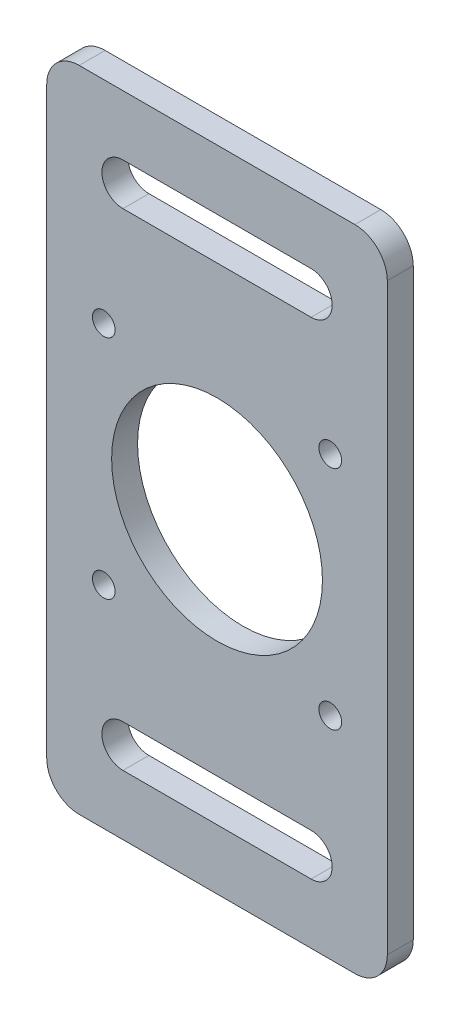
ISO-10303-21;
HEADER;
FILE_DESCRIPTION(('STEP AP214'),'2;1');
FILE_NAME('part.step','',(''),(''),'','','');
FILE_SCHEMA(('AUTOMOTIVE_DESIGN { 1 0 10303 214 1 1 1 1 }'));
ENDSEC;
DATA;
#1=APPLICATION_CONTEXT('core data for automotive mechanical design processes');
#2=APPLICATION_PROTOCOL_DEFINITION('international standard','automotive_design',2000,#1);
#3=PRODUCT_CONTEXT('',#1,'mechanical');
#4=PRODUCT('Part','Part','',(#3));
#5=PRODUCT_RELATED_PRODUCT_CATEGORY('part','',(#4));
#6=PRODUCT_DEFINITION_FORMATION('','',#4);
#7=PRODUCT_DEFINITION_CONTEXT('part definition',#1,'design');
#8=PRODUCT_DEFINITION('design','',#6,#7);
#9=PRODUCT_DEFINITION_SHAPE('','',#8);
#10=(LENGTH_UNIT() NAMED_UNIT(*) SI_UNIT(.MILLI.,.METRE.));
#11=(NAMED_UNIT(*) PLANE_ANGLE_UNIT() SI_UNIT($,.RADIAN.));
#12=(NAMED_UNIT(*) SI_UNIT($,.STERADIAN.) SOLID_ANGLE_UNIT());
#13=UNCERTAINTY_MEASURE_WITH_UNIT(LENGTH_MEASURE(1.E-05),#10,'distance_accuracy_value','');
#14=(GEOMETRIC_REPRESENTATION_CONTEXT(3) GLOBAL_UNCERTAINTY_ASSIGNED_CONTEXT((#13)) GLOBAL_UNIT_ASSIGNED_CONTEXT((#10,
#11,#12)) REPRESENTATION_CONTEXT('',''));
#15=CARTESIAN_POINT('',(0.,0.,0.));
#16=DIRECTION('',(0.,0.,1.));
#17=DIRECTION('',(1.,0.,0.));
#18=AXIS2_PLACEMENT_3D('',#15,#16,#17);
#19=CARTESIAN_POINT('',(0.,0.,8.));
#20=DIRECTION('',(0.,0.,1.));
#21=DIRECTION('',(1.,0.,0.));
#22=AXIS2_PLACEMENT_3D('',#19,#20,#21);
#23=PLANE('',#22);
#24=CARTESIAN_POINT('',(34.915,-34.915,8.));
#25=DIRECTION('',(0.,0.,1.));
#26=DIRECTION('',(1.,0.,0.));
#27=AXIS2_PLACEMENT_3D('',#24,#25,#26);
#28=CIRCLE('',#27,3.5);
#29=CARTESIAN_POINT('',(38.415,-34.915,8.));
#30=VERTEX_POINT('',#29);
#31=EDGE_CURVE('E234',#30,#30,#28,.T.);
#32=ORIENTED_EDGE('',*,*,#31,.F.);
#33=EDGE_LOOP('',(#32));
#34=FACE_BOUND('',#33,.T.);
#35=CARTESIAN_POINT('',(-34.915,34.915,8.));
#36=DIRECTION('',(0.,0.,1.));
#37=DIRECTION('',(1.,0.,0.));
#38=AXIS2_PLACEMENT_3D('',#35,#36,#37);
#39=CIRCLE('',#38,3.49999999999999);
#40=CARTESIAN_POINT('',(-31.4150000000001,34.915,8.));
#41=VERTEX_POINT('',#40);
#42=EDGE_CURVE('E246',#41,#41,#39,.T.);
#43=ORIENTED_EDGE('',*,*,#42,.F.);
#44=EDGE_LOOP('',(#43));
#45=FACE_BOUND('',#44,.T.);
#46=DIRECTION('',(-1.,0.,0.));
#47=VECTOR('',#46,1.);
#48=CARTESIAN_POINT('',(52.5,100.,8.));
#49=LINE('',#48,#47);
#50=CARTESIAN_POINT('',(42.5,100.,8.));
#51=VERTEX_POINT('',#50);
#52=CARTESIAN_POINT('',(-42.5,100.,8.));
#53=VERTEX_POINT('',#52);
#54=EDGE_CURVE('E266',#51,#53,#49,.T.);
#55=ORIENTED_EDGE('',*,*,#54,.T.);
#56=CARTESIAN_POINT('',(-42.5,90.,8.));
#57=DIRECTION('',(0.,0.,1.));
#58=DIRECTION('',(1.,0.,0.));
#59=AXIS2_PLACEMENT_3D('',#56,#57,#58);
#60=CIRCLE('',#59,10.);
#61=CARTESIAN_POINT('',(-52.5,90.,8.));
#62=VERTEX_POINT('',#61);
#63=EDGE_CURVE('E301',#53,#62,#60,.T.);
#64=ORIENTED_EDGE('',*,*,#63,.T.);
#65=DIRECTION('',(0.,-1.,0.));
#66=VECTOR('',#65,1.);
#67=CARTESIAN_POINT('',(-52.5,-100.,8.));
#68=LINE('',#67,#66);
#69=CARTESIAN_POINT('',(-52.5,-90.,8.));
#70=VERTEX_POINT('',#69);
#71=EDGE_CURVE('E258',#62,#70,#68,.T.);
#72=ORIENTED_EDGE('',*,*,#71,.T.);
#73=CARTESIAN_POINT('',(-42.5,-90.,8.));
#74=DIRECTION('',(0.,0.,1.));
#75=DIRECTION('',(1.,0.,0.));
#76=AXIS2_PLACEMENT_3D('',#73,#74,#75);
#77=CIRCLE('',#76,10.);
#78=CARTESIAN_POINT('',(-42.5,-100.,8.));
#79=VERTEX_POINT('',#78);
#80=EDGE_CURVE('E296',#70,#79,#77,.T.);
#81=ORIENTED_EDGE('',*,*,#80,.T.);
#82=DIRECTION('',(1.,0.,0.));
#83=VECTOR('',#82,1.);
#84=CARTESIAN_POINT('',(52.5,-100.,8.));
#85=LINE('',#84,#83);
#86=CARTESIAN_POINT('',(42.5,-100.,8.));
#87=VERTEX_POINT('',#86);
#88=EDGE_CURVE('E261',#79,#87,#85,.T.);
#89=ORIENTED_EDGE('',*,*,#88,.T.);
#90=CARTESIAN_POINT('',(42.5,-90.,8.));
#91=DIRECTION('',(0.,0.,1.));
#92=DIRECTION('',(1.,0.,0.));
#93=AXIS2_PLACEMENT_3D('',#90,#91,#92);
#94=CIRCLE('',#93,10.);
#95=CARTESIAN_POINT('',(52.5,-90.,8.));
#96=VERTEX_POINT('',#95);
#97=EDGE_CURVE('E63',#87,#96,#94,.T.);
#98=ORIENTED_EDGE('',*,*,#97,.T.);
#99=DIRECTION('',(0.,1.,0.));
#100=VECTOR('',#99,1.);
#101=CARTESIAN_POINT('',(52.5,-100.,8.));
#102=LINE('',#101,#100);
#103=CARTESIAN_POINT('',(52.5,90.,8.));
#104=VERTEX_POINT('',#103);
#105=EDGE_CURVE('E264',#96,#104,#102,.T.);
#106=ORIENTED_EDGE('',*,*,#105,.T.);
#107=CARTESIAN_POINT('',(42.5,90.,8.));
#108=DIRECTION('',(0.,0.,1.));
#109=DIRECTION('',(1.,0.,0.));
#110=AXIS2_PLACEMENT_3D('',#107,#108,#109);
#111=CIRCLE('',#110,10.);
#112=EDGE_CURVE('E299',#104,#51,#111,.T.);
#113=ORIENTED_EDGE('',*,*,#112,.T.);
#114=EDGE_LOOP('',(#55,#64,#72,#81,#89,#98,#106,#113));
#115=FACE_BOUND('',#114,.T.);
#116=CARTESIAN_POINT('',(0.,0.,8.));
#117=DIRECTION('',(0.,0.,1.));
#118=DIRECTION('',(1.,0.,0.));
#119=AXIS2_PLACEMENT_3D('',#116,#117,#118);
#120=CIRCLE('',#119,32.5);
#121=CARTESIAN_POINT('',(32.5,0.,8.));
#122=VERTEX_POINT('',#121);
#123=EDGE_CURVE('E252',#122,#122,#120,.T.);
#124=ORIENTED_EDGE('',*,*,#123,.F.);
#125=EDGE_LOOP('',(#124));
#126=FACE_BOUND('',#125,.T.);
#127=CARTESIAN_POINT('',(34.915,34.915,8.));
#128=DIRECTION('',(0.,0.,1.));
#129=DIRECTION('',(1.,0.,0.));
#130=AXIS2_PLACEMENT_3D('',#127,#128,#129);
#131=CIRCLE('',#130,3.5);
#132=CARTESIAN_POINT('',(38.415,34.915,8.));
#133=VERTEX_POINT('',#132);
#134=EDGE_CURVE('E240',#133,#133,#131,.T.);
#135=ORIENTED_EDGE('',*,*,#134,.F.);
#136=EDGE_LOOP('',(#135));
#137=FACE_BOUND('',#136,.T.);
#138=CARTESIAN_POINT('',(-34.915,-34.915,8.));
#139=DIRECTION('',(0.,0.,1.));
#140=DIRECTION('',(1.,0.,0.));
#141=AXIS2_PLACEMENT_3D('',#138,#139,#140);
#142=CIRCLE('',#141,3.5);
#143=CARTESIAN_POINT('',(-31.415,-34.915,8.));
#144=VERTEX_POINT('',#143);
#145=EDGE_CURVE('E228',#144,#144,#142,.T.);
#146=ORIENTED_EDGE('',*,*,#145,.F.);
#147=EDGE_LOOP('',(#146));
#148=FACE_BOUND('',#147,.T.);
#149=DIRECTION('',(1.,0.,0.));
#150=VECTOR('',#149,1.);
#151=CARTESIAN_POINT('',(-28.9999999999999,68.5,8.));
#152=LINE('',#151,#150);
#153=CARTESIAN_POINT('',(-28.9999999999999,68.5,8.));
#154=VERTEX_POINT('',#153);
#155=CARTESIAN_POINT('',(28.9999999999999,68.5,8.));
#156=VERTEX_POINT('',#155);
#157=EDGE_CURVE('E199',#154,#156,#152,.T.);
#158=ORIENTED_EDGE('',*,*,#157,.F.);
#159=CARTESIAN_POINT('',(-29.,75.,8.));
#160=DIRECTION('',(0.,0.,1.));
#161=DIRECTION('',(1.,0.,0.));
#162=AXIS2_PLACEMENT_3D('',#159,#160,#161);
#163=CIRCLE('',#162,6.50000000000002);
#164=CARTESIAN_POINT('',(-29.,81.5,8.));
#165=VERTEX_POINT('',#164);
#166=EDGE_CURVE('E197',#165,#154,#163,.T.);
#167=ORIENTED_EDGE('',*,*,#166,.F.);
#168=DIRECTION('',(-1.,0.,0.));
#169=VECTOR('',#168,1.);
#170=CARTESIAN_POINT('',(-29.,81.5,8.));
#171=LINE('',#170,#169);
#172=CARTESIAN_POINT('',(29.,81.5,8.));
#173=VERTEX_POINT('',#172);
#174=EDGE_CURVE('E205',#173,#165,#171,.T.);
#175=ORIENTED_EDGE('',*,*,#174,.F.);
#176=CARTESIAN_POINT('',(29.,75.,8.));
#177=DIRECTION('',(0.,0.,1.));
#178=DIRECTION('',(1.,0.,0.));
#179=AXIS2_PLACEMENT_3D('',#176,#177,#178);
#180=CIRCLE('',#179,6.50000000000002);
#181=EDGE_CURVE('E202',#156,#173,#180,.T.);
#182=ORIENTED_EDGE('',*,*,#181,.F.);
#183=EDGE_LOOP('',(#158,#167,#175,#182));
#184=FACE_BOUND('',#183,.T.);
#185=DIRECTION('',(1.,0.,0.));
#186=VECTOR('',#185,1.);
#187=CARTESIAN_POINT('',(-28.9999999999999,-81.5,8.));
#188=LINE('',#187,#186);
#189=CARTESIAN_POINT('',(-28.9999999999999,-81.5,8.));
#190=VERTEX_POINT('',#189);
#191=CARTESIAN_POINT('',(29.,-81.5,8.));
#192=VERTEX_POINT('',#191);
#193=EDGE_CURVE('E166',#190,#192,#188,.T.);
#194=ORIENTED_EDGE('',*,*,#193,.F.);
#195=CARTESIAN_POINT('',(-28.9999999999999,-75.,8.));
#196=DIRECTION('',(0.,0.,1.));
#197=DIRECTION('',(-1.,0.,0.));
#198=AXIS2_PLACEMENT_3D('',#195,#196,#197);
#199=CIRCLE('',#198,6.50000000000003);
#200=CARTESIAN_POINT('',(-28.9999999999999,-68.5,8.));
#201=VERTEX_POINT('',#200);
#202=EDGE_CURVE('E156',#201,#190,#199,.T.);
#203=ORIENTED_EDGE('',*,*,#202,.F.);
#204=DIRECTION('',(-1.,0.,0.));
#205=VECTOR('',#204,1.);
#206=CARTESIAN_POINT('',(-28.9999999999999,-68.5,8.));
#207=LINE('',#206,#205);
#208=CARTESIAN_POINT('',(29.,-68.4999999999999,8.));
#209=VERTEX_POINT('',#208);
#210=EDGE_CURVE('E181',#209,#201,#207,.T.);
#211=ORIENTED_EDGE('',*,*,#210,.F.);
#212=CARTESIAN_POINT('',(29.,-75.,8.));
#213=DIRECTION('',(0.,0.,1.));
#214=DIRECTION('',(-1.,0.,0.));
#215=AXIS2_PLACEMENT_3D('',#212,#213,#214);
#216=CIRCLE('',#215,6.50000000000003);
#217=EDGE_CURVE('E179',#192,#209,#216,.T.);
#218=ORIENTED_EDGE('',*,*,#217,.F.);
#219=EDGE_LOOP('',(#194,#203,#211,#218));
#220=FACE_BOUND('',#219,.T.);
#221=ADVANCED_FACE('F41',(#34,#45,#115,#126,#137,#148,#184,#220),#23,.T.);
#222=CARTESIAN_POINT('',(0.,0.,0.));
#223=DIRECTION('',(0.,0.,1.));
#224=DIRECTION('',(1.,0.,0.));
#225=AXIS2_PLACEMENT_3D('',#222,#223,#224);
#226=PLANE('',#225);
#227=CARTESIAN_POINT('',(-29.,75.,0.));
#228=DIRECTION('',(0.,0.,1.));
#229=DIRECTION('',(1.,0.,0.));
#230=AXIS2_PLACEMENT_3D('',#227,#228,#229);
#231=CIRCLE('',#230,6.50000000000002);
#232=CARTESIAN_POINT('',(-29.,81.5,0.));
#233=VERTEX_POINT('',#232);
#234=CARTESIAN_POINT('',(-28.9999999999999,68.5,0.));
#235=VERTEX_POINT('',#234);
#236=EDGE_CURVE('E174',#233,#235,#231,.T.);
#237=ORIENTED_EDGE('',*,*,#236,.T.);
#238=DIRECTION('',(1.,0.,0.));
#239=VECTOR('',#238,1.);
#240=CARTESIAN_POINT('',(-28.9999999999999,68.5,0.));
#241=LINE('',#240,#239);
#242=CARTESIAN_POINT('',(28.9999999999999,68.5,0.));
#243=VERTEX_POINT('',#242);
#244=EDGE_CURVE('E210',#235,#243,#241,.T.);
#245=ORIENTED_EDGE('',*,*,#244,.T.);
#246=CARTESIAN_POINT('',(29.,75.,0.));
#247=DIRECTION('',(0.,0.,1.));
#248=DIRECTION('',(1.,0.,0.));
#249=AXIS2_PLACEMENT_3D('',#246,#247,#248);
#250=CIRCLE('',#249,6.50000000000002);
#251=CARTESIAN_POINT('',(29.,81.5,0.));
#252=VERTEX_POINT('',#251);
#253=EDGE_CURVE('E213',#243,#252,#250,.T.);
#254=ORIENTED_EDGE('',*,*,#253,.T.);
#255=DIRECTION('',(-1.,0.,0.));
#256=VECTOR('',#255,1.);
#257=CARTESIAN_POINT('',(-29.,81.5,0.));
#258=LINE('',#257,#256);
#259=EDGE_CURVE('E200',#252,#233,#258,.T.);
#260=ORIENTED_EDGE('',*,*,#259,.T.);
#261=EDGE_LOOP('',(#237,#245,#254,#260));
#262=FACE_BOUND('',#261,.T.);
#263=DIRECTION('',(0.,-1.,0.));
#264=VECTOR('',#263,1.);
#265=CARTESIAN_POINT('',(-52.5,-100.,0.));
#266=LINE('',#265,#264);
#267=CARTESIAN_POINT('',(-52.5,90.,0.));
#268=VERTEX_POINT('',#267);
#269=CARTESIAN_POINT('',(-52.5,-90.,0.));
#270=VERTEX_POINT('',#269);
#271=EDGE_CURVE('E255',#268,#270,#266,.T.);
#272=ORIENTED_EDGE('',*,*,#271,.F.);
#273=CARTESIAN_POINT('',(-42.5,90.,0.));
#274=DIRECTION('',(0.,0.,1.));
#275=DIRECTION('',(1.,0.,0.));
#276=AXIS2_PLACEMENT_3D('',#273,#274,#275);
#277=CIRCLE('',#276,10.);
#278=CARTESIAN_POINT('',(-42.5,100.,0.));
#279=VERTEX_POINT('',#278);
#280=EDGE_CURVE('E289',#268,#279,#277,.F.);
#281=ORIENTED_EDGE('',*,*,#280,.T.);
#282=DIRECTION('',(-1.,0.,0.));
#283=VECTOR('',#282,1.);
#284=CARTESIAN_POINT('',(52.5,100.,0.));
#285=LINE('',#284,#283);
#286=CARTESIAN_POINT('',(42.5,100.,0.));
#287=VERTEX_POINT('',#286);
#288=EDGE_CURVE('E262',#287,#279,#285,.T.);
#289=ORIENTED_EDGE('',*,*,#288,.F.);
#290=CARTESIAN_POINT('',(42.5,90.,0.));
#291=DIRECTION('',(0.,0.,1.));
#292=DIRECTION('',(1.,0.,0.));
#293=AXIS2_PLACEMENT_3D('',#290,#291,#292);
#294=CIRCLE('',#293,10.);
#295=CARTESIAN_POINT('',(52.5,90.,0.));
#296=VERTEX_POINT('',#295);
#297=EDGE_CURVE('E287',#287,#296,#294,.F.);
#298=ORIENTED_EDGE('',*,*,#297,.T.);
#299=DIRECTION('',(0.,1.,0.));
#300=VECTOR('',#299,1.);
#301=CARTESIAN_POINT('',(52.5,-100.,0.));
#302=LINE('',#301,#300);
#303=CARTESIAN_POINT('',(52.5,-90.,0.));
#304=VERTEX_POINT('',#303);
#305=EDGE_CURVE('E275',#304,#296,#302,.T.);
#306=ORIENTED_EDGE('',*,*,#305,.F.);
#307=CARTESIAN_POINT('',(42.5,-90.,0.));
#308=DIRECTION('',(0.,0.,1.));
#309=DIRECTION('',(1.,0.,0.));
#310=AXIS2_PLACEMENT_3D('',#307,#308,#309);
#311=CIRCLE('',#310,10.);
#312=CARTESIAN_POINT('',(42.5,-100.,0.));
#313=VERTEX_POINT('',#312);
#314=EDGE_CURVE('E285',#304,#313,#311,.F.);
#315=ORIENTED_EDGE('',*,*,#314,.T.);
#316=DIRECTION('',(1.,0.,0.));
#317=VECTOR('',#316,1.);
#318=CARTESIAN_POINT('',(52.5,-100.,0.));
#319=LINE('',#318,#317);
#320=CARTESIAN_POINT('',(-42.5,-100.,0.));
#321=VERTEX_POINT('',#320);
#322=EDGE_CURVE('E272',#321,#313,#319,.T.);
#323=ORIENTED_EDGE('',*,*,#322,.F.);
#324=CARTESIAN_POINT('',(-42.5,-90.,0.));
#325=DIRECTION('',(0.,0.,1.));
#326=DIRECTION('',(1.,0.,0.));
#327=AXIS2_PLACEMENT_3D('',#324,#325,#326);
#328=CIRCLE('',#327,10.);
#329=EDGE_CURVE('E283',#321,#270,#328,.F.);
#330=ORIENTED_EDGE('',*,*,#329,.T.);
#331=EDGE_LOOP('',(#272,#281,#289,#298,#306,#315,#323,#330));
#332=FACE_BOUND('',#331,.T.);
#333=CARTESIAN_POINT('',(0.,0.,0.));
#334=DIRECTION('',(0.,0.,1.));
#335=DIRECTION('',(1.,0.,0.));
#336=AXIS2_PLACEMENT_3D('',#333,#334,#335);
#337=CIRCLE('',#336,32.5);
#338=CARTESIAN_POINT('',(32.5,0.,0.));
#339=VERTEX_POINT('',#338);
#340=EDGE_CURVE('E249',#339,#339,#337,.T.);
#341=ORIENTED_EDGE('',*,*,#340,.T.);
#342=EDGE_LOOP('',(#341));
#343=FACE_BOUND('',#342,.T.);
#344=CARTESIAN_POINT('',(-34.915,34.915,0.));
#345=DIRECTION('',(0.,0.,1.));
#346=DIRECTION('',(1.,0.,0.));
#347=AXIS2_PLACEMENT_3D('',#344,#345,#346);
#348=CIRCLE('',#347,3.49999999999999);
#349=CARTESIAN_POINT('',(-31.4150000000001,34.915,0.));
#350=VERTEX_POINT('',#349);
#351=EDGE_CURVE('E243',#350,#350,#348,.T.);
#352=ORIENTED_EDGE('',*,*,#351,.T.);
#353=EDGE_LOOP('',(#352));
#354=FACE_BOUND('',#353,.T.);
#355=CARTESIAN_POINT('',(34.915,34.915,0.));
#356=DIRECTION('',(0.,0.,1.));
#357=DIRECTION('',(1.,0.,0.));
#358=AXIS2_PLACEMENT_3D('',#355,#356,#357);
#359=CIRCLE('',#358,3.5);
#360=CARTESIAN_POINT('',(38.415,34.915,0.));
#361=VERTEX_POINT('',#360);
#362=EDGE_CURVE('E237',#361,#361,#359,.T.);
#363=ORIENTED_EDGE('',*,*,#362,.T.);
#364=EDGE_LOOP('',(#363));
#365=FACE_BOUND('',#364,.T.);
#366=CARTESIAN_POINT('',(34.915,-34.915,0.));
#367=DIRECTION('',(0.,0.,1.));
#368=DIRECTION('',(1.,0.,0.));
#369=AXIS2_PLACEMENT_3D('',#366,#367,#368);
#370=CIRCLE('',#369,3.5);
#371=CARTESIAN_POINT('',(38.415,-34.915,0.));
#372=VERTEX_POINT('',#371);
#373=EDGE_CURVE('E231',#372,#372,#370,.T.);
#374=ORIENTED_EDGE('',*,*,#373,.T.);
#375=EDGE_LOOP('',(#374));
#376=FACE_BOUND('',#375,.T.);
#377=CARTESIAN_POINT('',(-34.915,-34.915,0.));
#378=DIRECTION('',(0.,0.,1.));
#379=DIRECTION('',(1.,0.,0.));
#380=AXIS2_PLACEMENT_3D('',#377,#378,#379);
#381=CIRCLE('',#380,3.5);
#382=CARTESIAN_POINT('',(-31.415,-34.915,0.));
#383=VERTEX_POINT('',#382);
#384=EDGE_CURVE('E227',#383,#383,#381,.T.);
#385=ORIENTED_EDGE('',*,*,#384,.T.);
#386=EDGE_LOOP('',(#385));
#387=FACE_BOUND('',#386,.T.);
#388=CARTESIAN_POINT('',(-28.9999999999999,-75.,0.));
#389=DIRECTION('',(0.,0.,1.));
#390=DIRECTION('',(-1.,0.,0.));
#391=AXIS2_PLACEMENT_3D('',#388,#389,#390);
#392=CIRCLE('',#391,6.50000000000003);
#393=CARTESIAN_POINT('',(-28.9999999999999,-68.5,0.));
#394=VERTEX_POINT('',#393);
#395=CARTESIAN_POINT('',(-28.9999999999999,-81.5,0.));
#396=VERTEX_POINT('',#395);
#397=EDGE_CURVE('E185',#394,#396,#392,.T.);
#398=ORIENTED_EDGE('',*,*,#397,.T.);
#399=DIRECTION('',(1.,0.,0.));
#400=VECTOR('',#399,1.);
#401=CARTESIAN_POINT('',(-28.9999999999999,-81.5,0.));
#402=LINE('',#401,#400);
#403=CARTESIAN_POINT('',(29.,-81.5,0.));
#404=VERTEX_POINT('',#403);
#405=EDGE_CURVE('E173',#396,#404,#402,.T.);
#406=ORIENTED_EDGE('',*,*,#405,.T.);
#407=CARTESIAN_POINT('',(29.,-75.,0.));
#408=DIRECTION('',(0.,0.,1.));
#409=DIRECTION('',(-1.,0.,0.));
#410=AXIS2_PLACEMENT_3D('',#407,#408,#409);
#411=CIRCLE('',#410,6.50000000000003);
#412=CARTESIAN_POINT('',(29.,-68.5,0.));
#413=VERTEX_POINT('',#412);
#414=EDGE_CURVE('E188',#404,#413,#411,.T.);
#415=ORIENTED_EDGE('',*,*,#414,.T.);
#416=DIRECTION('',(-1.,0.,0.));
#417=VECTOR('',#416,1.);
#418=CARTESIAN_POINT('',(-28.9999999999999,-68.5,0.));
#419=LINE('',#418,#417);
#420=EDGE_CURVE('E167',#413,#394,#419,.T.);
#421=ORIENTED_EDGE('',*,*,#420,.T.);
#422=EDGE_LOOP('',(#398,#406,#415,#421));
#423=FACE_BOUND('',#422,.T.);
#424=ADVANCED_FACE('F317',(#262,#332,#343,#354,#365,#376,#387,#423),#226,.F.);
#425=CARTESIAN_POINT('',(-52.5,-100.,8.));
#426=DIRECTION('',(1.,0.,0.));
#427=DIRECTION('',(0.,0.,-1.));
#428=AXIS2_PLACEMENT_3D('',#425,#426,#427);
#429=PLANE('',#428);
#430=ORIENTED_EDGE('',*,*,#71,.F.);
#431=DIRECTION('',(0.,0.,-1.));
#432=VECTOR('',#431,1.);
#433=CARTESIAN_POINT('',(-52.5,90.,8.));
#434=LINE('',#433,#432);
#435=EDGE_CURVE('E280',#62,#268,#434,.T.);
#436=ORIENTED_EDGE('',*,*,#435,.T.);
#437=ORIENTED_EDGE('',*,*,#271,.T.);
#438=DIRECTION('',(0.,0.,-1.));
#439=VECTOR('',#438,1.);
#440=CARTESIAN_POINT('',(-52.5,-90.,8.));
#441=LINE('',#440,#439);
#442=EDGE_CURVE('E269',#270,#70,#441,.F.);
#443=ORIENTED_EDGE('',*,*,#442,.T.);
#444=EDGE_LOOP('',(#430,#436,#437,#443));
#445=FACE_BOUND('',#444,.T.);
#446=ADVANCED_FACE('F340',(#445),#429,.F.);
#447=CARTESIAN_POINT('',(52.5,-100.,8.));
#448=DIRECTION('',(0.,1.,0.));
#449=DIRECTION('',(0.,0.,1.));
#450=AXIS2_PLACEMENT_3D('',#447,#448,#449);
#451=PLANE('',#450);
#452=ORIENTED_EDGE('',*,*,#322,.T.);
#453=DIRECTION('',(0.,0.,-1.));
#454=VECTOR('',#453,1.);
#455=CARTESIAN_POINT('',(42.5,-100.,8.));
#456=LINE('',#455,#454);
#457=EDGE_CURVE('E11',#313,#87,#456,.F.);
#458=ORIENTED_EDGE('',*,*,#457,.T.);
#459=ORIENTED_EDGE('',*,*,#88,.F.);
#460=DIRECTION('',(0.,0.,-1.));
#461=VECTOR('',#460,1.);
#462=CARTESIAN_POINT('',(-42.5,-100.,8.));
#463=LINE('',#462,#461);
#464=EDGE_CURVE('E49',#79,#321,#463,.T.);
#465=ORIENTED_EDGE('',*,*,#464,.T.);
#466=EDGE_LOOP('',(#452,#458,#459,#465));
#467=FACE_BOUND('',#466,.T.);
#468=ADVANCED_FACE('F311',(#467),#451,.F.);
#469=CARTESIAN_POINT('',(52.5,-100.,8.));
#470=DIRECTION('',(-1.,0.,0.));
#471=DIRECTION('',(0.,0.,1.));
#472=AXIS2_PLACEMENT_3D('',#469,#470,#471);
#473=PLANE('',#472);
#474=ORIENTED_EDGE('',*,*,#305,.T.);
#475=DIRECTION('',(0.,0.,-1.));
#476=VECTOR('',#475,1.);
#477=CARTESIAN_POINT('',(52.5,90.,8.));
#478=LINE('',#477,#476);
#479=EDGE_CURVE('E56',#296,#104,#478,.F.);
#480=ORIENTED_EDGE('',*,*,#479,.T.);
#481=ORIENTED_EDGE('',*,*,#105,.F.);
#482=DIRECTION('',(0.,0.,-1.));
#483=VECTOR('',#482,1.);
#484=CARTESIAN_POINT('',(52.5,-90.,8.));
#485=LINE('',#484,#483);
#486=EDGE_CURVE('E303',#96,#304,#485,.T.);
#487=ORIENTED_EDGE('',*,*,#486,.T.);
#488=EDGE_LOOP('',(#474,#480,#481,#487));
#489=FACE_BOUND('',#488,.T.);
#490=ADVANCED_FACE('F323',(#489),#473,.F.);
#491=CARTESIAN_POINT('',(52.5,100.,8.));
#492=DIRECTION('',(0.,-1.,0.));
#493=DIRECTION('',(1.,0.,0.));
#494=AXIS2_PLACEMENT_3D('',#491,#492,#493);
#495=PLANE('',#494);
#496=ORIENTED_EDGE('',*,*,#288,.T.);
#497=DIRECTION('',(0.,0.,-1.));
#498=VECTOR('',#497,1.);
#499=CARTESIAN_POINT('',(-42.5,100.,8.));
#500=LINE('',#499,#498);
#501=EDGE_CURVE('E294',#279,#53,#500,.F.);
#502=ORIENTED_EDGE('',*,*,#501,.T.);
#503=ORIENTED_EDGE('',*,*,#54,.F.);
#504=DIRECTION('',(0.,0.,-1.));
#505=VECTOR('',#504,1.);
#506=CARTESIAN_POINT('',(42.5,100.,8.));
#507=LINE('',#506,#505);
#508=EDGE_CURVE('E291',#51,#287,#507,.T.);
#509=ORIENTED_EDGE('',*,*,#508,.T.);
#510=EDGE_LOOP('',(#496,#502,#503,#509));
#511=FACE_BOUND('',#510,.T.);
#512=ADVANCED_FACE('F332',(#511),#495,.F.);
#513=CARTESIAN_POINT('',(0.,0.,8.));
#514=DIRECTION('',(0.,0.,-1.));
#515=DIRECTION('',(-1.,0.,0.));
#516=AXIS2_PLACEMENT_3D('',#513,#514,#515);
#517=CYLINDRICAL_SURFACE('',#516,32.5);
#518=ORIENTED_EDGE('',*,*,#123,.T.);
#519=EDGE_LOOP('',(#518));
#520=FACE_BOUND('',#519,.T.);
#521=ORIENTED_EDGE('',*,*,#340,.F.);
#522=EDGE_LOOP('',(#521));
#523=FACE_BOUND('',#522,.T.);
#524=ADVANCED_FACE('F359',(#520,#523),#517,.F.);
#525=CARTESIAN_POINT('',(-34.915,34.915,8.));
#526=DIRECTION('',(0.,0.,-1.));
#527=DIRECTION('',(-1.,0.,0.));
#528=AXIS2_PLACEMENT_3D('',#525,#526,#527);
#529=CYLINDRICAL_SURFACE('',#528,3.49999999999999);
#530=ORIENTED_EDGE('',*,*,#42,.T.);
#531=EDGE_LOOP('',(#530));
#532=FACE_BOUND('',#531,.T.);
#533=ORIENTED_EDGE('',*,*,#351,.F.);
#534=EDGE_LOOP('',(#533));
#535=FACE_BOUND('',#534,.T.);
#536=ADVANCED_FACE('F536',(#532,#535),#529,.F.);
#537=CARTESIAN_POINT('',(34.915,34.915,8.));
#538=DIRECTION('',(0.,0.,-1.));
#539=DIRECTION('',(-1.,0.,0.));
#540=AXIS2_PLACEMENT_3D('',#537,#538,#539);
#541=CYLINDRICAL_SURFACE('',#540,3.5);
#542=ORIENTED_EDGE('',*,*,#134,.T.);
#543=EDGE_LOOP('',(#542));
#544=FACE_BOUND('',#543,.T.);
#545=ORIENTED_EDGE('',*,*,#362,.F.);
#546=EDGE_LOOP('',(#545));
#547=FACE_BOUND('',#546,.T.);
#548=ADVANCED_FACE('F526',(#544,#547),#541,.F.);
#549=CARTESIAN_POINT('',(34.915,-34.915,8.));
#550=DIRECTION('',(0.,0.,-1.));
#551=DIRECTION('',(-1.,0.,0.));
#552=AXIS2_PLACEMENT_3D('',#549,#550,#551);
#553=CYLINDRICAL_SURFACE('',#552,3.5);
#554=ORIENTED_EDGE('',*,*,#31,.T.);
#555=EDGE_LOOP('',(#554));
#556=FACE_BOUND('',#555,.T.);
#557=ORIENTED_EDGE('',*,*,#373,.F.);
#558=EDGE_LOOP('',(#557));
#559=FACE_BOUND('',#558,.T.);
#560=ADVANCED_FACE('F516',(#556,#559),#553,.F.);
#561=CARTESIAN_POINT('',(-34.915,-34.915,8.));
#562=DIRECTION('',(0.,0.,-1.));
#563=DIRECTION('',(-1.,0.,0.));
#564=AXIS2_PLACEMENT_3D('',#561,#562,#563);
#565=CYLINDRICAL_SURFACE('',#564,3.5);
#566=ORIENTED_EDGE('',*,*,#145,.T.);
#567=EDGE_LOOP('',(#566));
#568=FACE_BOUND('',#567,.T.);
#569=ORIENTED_EDGE('',*,*,#384,.F.);
#570=EDGE_LOOP('',(#569));
#571=FACE_BOUND('',#570,.T.);
#572=ADVANCED_FACE('F506',(#568,#571),#565,.F.);
#573=CARTESIAN_POINT('',(-29.,75.,8.));
#574=DIRECTION('',(0.,0.,-1.));
#575=DIRECTION('',(-1.,0.,0.));
#576=AXIS2_PLACEMENT_3D('',#573,#574,#575);
#577=CYLINDRICAL_SURFACE('',#576,6.50000000000002);
#578=ORIENTED_EDGE('',*,*,#236,.F.);
#579=DIRECTION('',(0.,0.,-1.));
#580=VECTOR('',#579,1.);
#581=CARTESIAN_POINT('',(-29.,81.5,8.));
#582=LINE('',#581,#580);
#583=EDGE_CURVE('E207',#165,#233,#582,.T.);
#584=ORIENTED_EDGE('',*,*,#583,.F.);
#585=ORIENTED_EDGE('',*,*,#166,.T.);
#586=DIRECTION('',(0.,0.,-1.));
#587=VECTOR('',#586,1.);
#588=CARTESIAN_POINT('',(-28.9999999999999,68.5,8.));
#589=LINE('',#588,#587);
#590=EDGE_CURVE('E224',#154,#235,#589,.T.);
#591=ORIENTED_EDGE('',*,*,#590,.T.);
#592=EDGE_LOOP('',(#578,#584,#585,#591));
#593=FACE_BOUND('',#592,.T.);
#594=ADVANCED_FACE('F496',(#593),#577,.F.);
#595=CARTESIAN_POINT('',(-28.9999999999999,68.5,8.));
#596=DIRECTION('',(0.,1.,0.));
#597=DIRECTION('',(-1.,0.,0.));
#598=AXIS2_PLACEMENT_3D('',#595,#596,#597);
#599=PLANE('',#598);
#600=ORIENTED_EDGE('',*,*,#244,.F.);
#601=ORIENTED_EDGE('',*,*,#590,.F.);
#602=ORIENTED_EDGE('',*,*,#157,.T.);
#603=DIRECTION('',(0.,0.,-1.));
#604=VECTOR('',#603,1.);
#605=CARTESIAN_POINT('',(28.9999999999999,68.5,8.));
#606=LINE('',#605,#604);
#607=EDGE_CURVE('E222',#156,#243,#606,.T.);
#608=ORIENTED_EDGE('',*,*,#607,.T.);
#609=EDGE_LOOP('',(#600,#601,#602,#608));
#610=FACE_BOUND('',#609,.T.);
#611=ADVANCED_FACE('F486',(#610),#599,.T.);
#612=CARTESIAN_POINT('',(29.,75.,8.));
#613=DIRECTION('',(0.,0.,-1.));
#614=DIRECTION('',(-1.,0.,0.));
#615=AXIS2_PLACEMENT_3D('',#612,#613,#614);
#616=CYLINDRICAL_SURFACE('',#615,6.50000000000002);
#617=ORIENTED_EDGE('',*,*,#253,.F.);
#618=ORIENTED_EDGE('',*,*,#607,.F.);
#619=ORIENTED_EDGE('',*,*,#181,.T.);
#620=DIRECTION('',(0.,0.,-1.));
#621=VECTOR('',#620,1.);
#622=CARTESIAN_POINT('',(29.,81.5,8.));
#623=LINE('',#622,#621);
#624=EDGE_CURVE('E220',#173,#252,#623,.T.);
#625=ORIENTED_EDGE('',*,*,#624,.T.);
#626=EDGE_LOOP('',(#617,#618,#619,#625));
#627=FACE_BOUND('',#626,.T.);
#628=ADVANCED_FACE('F476',(#627),#616,.F.);
#629=CARTESIAN_POINT('',(-29.,81.5,8.));
#630=DIRECTION('',(0.,-1.,0.));
#631=DIRECTION('',(1.,0.,0.));
#632=AXIS2_PLACEMENT_3D('',#629,#630,#631);
#633=PLANE('',#632);
#634=ORIENTED_EDGE('',*,*,#259,.F.);
#635=ORIENTED_EDGE('',*,*,#624,.F.);
#636=ORIENTED_EDGE('',*,*,#174,.T.);
#637=ORIENTED_EDGE('',*,*,#583,.T.);
#638=EDGE_LOOP('',(#634,#635,#636,#637));
#639=FACE_BOUND('',#638,.T.);
#640=ADVANCED_FACE('F467',(#639),#633,.T.);
#641=CARTESIAN_POINT('',(-28.9999999999999,-75.,8.));
#642=DIRECTION('',(0.,0.,-1.));
#643=DIRECTION('',(-1.,0.,0.));
#644=AXIS2_PLACEMENT_3D('',#641,#642,#643);
#645=CYLINDRICAL_SURFACE('',#644,6.50000000000003);
#646=ORIENTED_EDGE('',*,*,#397,.F.);
#647=DIRECTION('',(0.,0.,-1.));
#648=VECTOR('',#647,1.);
#649=CARTESIAN_POINT('',(-28.9999999999999,-68.5,8.));
#650=LINE('',#649,#648);
#651=EDGE_CURVE('E162',#201,#394,#650,.T.);
#652=ORIENTED_EDGE('',*,*,#651,.F.);
#653=ORIENTED_EDGE('',*,*,#202,.T.);
#654=DIRECTION('',(0.,0.,-1.));
#655=VECTOR('',#654,1.);
#656=CARTESIAN_POINT('',(-28.9999999999999,-81.5,8.));
#657=LINE('',#656,#655);
#658=EDGE_CURVE('E159',#190,#396,#657,.T.);
#659=ORIENTED_EDGE('',*,*,#658,.T.);
#660=EDGE_LOOP('',(#646,#652,#653,#659));
#661=FACE_BOUND('',#660,.T.);
#662=ADVANCED_FACE('F158',(#661),#645,.F.);
#663=CARTESIAN_POINT('',(-28.9999999999999,-81.5,8.));
#664=DIRECTION('',(0.,1.,0.));
#665=DIRECTION('',(-1.,0.,0.));
#666=AXIS2_PLACEMENT_3D('',#663,#664,#665);
#667=PLANE('',#666);
#668=ORIENTED_EDGE('',*,*,#405,.F.);
#669=ORIENTED_EDGE('',*,*,#658,.F.);
#670=ORIENTED_EDGE('',*,*,#193,.T.);
#671=DIRECTION('',(0.,0.,-1.));
#672=VECTOR('',#671,1.);
#673=CARTESIAN_POINT('',(29.,-81.5,8.));
#674=LINE('',#673,#672);
#675=EDGE_CURVE('E175',#192,#404,#674,.T.);
#676=ORIENTED_EDGE('',*,*,#675,.T.);
#677=EDGE_LOOP('',(#668,#669,#670,#676));
#678=FACE_BOUND('',#677,.T.);
#679=ADVANCED_FACE('F170',(#678),#667,.T.);
#680=CARTESIAN_POINT('',(29.,-75.,8.));
#681=DIRECTION('',(0.,0.,-1.));
#682=DIRECTION('',(-1.,0.,0.));
#683=AXIS2_PLACEMENT_3D('',#680,#681,#682);
#684=CYLINDRICAL_SURFACE('',#683,6.50000000000003);
#685=ORIENTED_EDGE('',*,*,#414,.F.);
#686=ORIENTED_EDGE('',*,*,#675,.F.);
#687=ORIENTED_EDGE('',*,*,#217,.T.);
#688=DIRECTION('',(0.,0.,-1.));
#689=VECTOR('',#688,1.);
#690=CARTESIAN_POINT('',(29.,-68.5,8.));
#691=LINE('',#690,#689);
#692=EDGE_CURVE('E194',#209,#413,#691,.T.);
#693=ORIENTED_EDGE('',*,*,#692,.T.);
#694=EDGE_LOOP('',(#685,#686,#687,#693));
#695=FACE_BOUND('',#694,.T.);
#696=ADVANCED_FACE('F440',(#695),#684,.F.);
#697=CARTESIAN_POINT('',(-28.9999999999999,-68.5,8.));
#698=DIRECTION('',(0.,-1.,0.));
#699=DIRECTION('',(1.,0.,0.));
#700=AXIS2_PLACEMENT_3D('',#697,#698,#699);
#701=PLANE('',#700);
#702=ORIENTED_EDGE('',*,*,#420,.F.);
#703=ORIENTED_EDGE('',*,*,#692,.F.);
#704=ORIENTED_EDGE('',*,*,#210,.T.);
#705=ORIENTED_EDGE('',*,*,#651,.T.);
#706=EDGE_LOOP('',(#702,#703,#704,#705));
#707=FACE_BOUND('',#706,.T.);
#708=ADVANCED_FACE('F372',(#707),#701,.T.);
#709=CARTESIAN_POINT('',(-42.5,90.,8.));
#710=DIRECTION('',(0.,0.,-1.));
#711=DIRECTION('',(-1.,0.,0.));
#712=AXIS2_PLACEMENT_3D('',#709,#710,#711);
#713=CYLINDRICAL_SURFACE('',#712,10.);
#714=ORIENTED_EDGE('',*,*,#63,.F.);
#715=ORIENTED_EDGE('',*,*,#501,.F.);
#716=ORIENTED_EDGE('',*,*,#280,.F.);
#717=ORIENTED_EDGE('',*,*,#435,.F.);
#718=EDGE_LOOP('',(#714,#715,#716,#717));
#719=FACE_BOUND('',#718,.T.);
#720=ADVANCED_FACE('F337',(#719),#713,.T.);
#721=CARTESIAN_POINT('',(42.5,90.,8.));
#722=DIRECTION('',(0.,0.,-1.));
#723=DIRECTION('',(-1.,0.,0.));
#724=AXIS2_PLACEMENT_3D('',#721,#722,#723);
#725=CYLINDRICAL_SURFACE('',#724,10.);
#726=ORIENTED_EDGE('',*,*,#112,.F.);
#727=ORIENTED_EDGE('',*,*,#479,.F.);
#728=ORIENTED_EDGE('',*,*,#297,.F.);
#729=ORIENTED_EDGE('',*,*,#508,.F.);
#730=EDGE_LOOP('',(#726,#727,#728,#729));
#731=FACE_BOUND('',#730,.T.);
#732=ADVANCED_FACE('F329',(#731),#725,.T.);
#733=CARTESIAN_POINT('',(42.5,-90.,8.));
#734=DIRECTION('',(0.,0.,-1.));
#735=DIRECTION('',(-1.,0.,0.));
#736=AXIS2_PLACEMENT_3D('',#733,#734,#735);
#737=CYLINDRICAL_SURFACE('',#736,10.);
#738=ORIENTED_EDGE('',*,*,#97,.F.);
#739=ORIENTED_EDGE('',*,*,#457,.F.);
#740=ORIENTED_EDGE('',*,*,#314,.F.);
#741=ORIENTED_EDGE('',*,*,#486,.F.);
#742=EDGE_LOOP('',(#738,#739,#740,#741));
#743=FACE_BOUND('',#742,.T.);
#744=ADVANCED_FACE('F322',(#743),#737,.T.);
#745=CARTESIAN_POINT('',(-42.5,-90.,8.));
#746=DIRECTION('',(0.,0.,-1.));
#747=DIRECTION('',(-1.,0.,0.));
#748=AXIS2_PLACEMENT_3D('',#745,#746,#747);
#749=CYLINDRICAL_SURFACE('',#748,10.);
#750=ORIENTED_EDGE('',*,*,#80,.F.);
#751=ORIENTED_EDGE('',*,*,#442,.F.);
#752=ORIENTED_EDGE('',*,*,#329,.F.);
#753=ORIENTED_EDGE('',*,*,#464,.F.);
#754=EDGE_LOOP('',(#750,#751,#752,#753));
#755=FACE_BOUND('',#754,.T.);
#756=ADVANCED_FACE('F43',(#755),#749,.T.);
#757=CLOSED_SHELL('',(#221,#424,#446,#468,#490,#512,#524,#536,#548,#560,#572,#594,#611,#628,
#640,#662,#679,#696,#708,#720,#732,#744,#756));
#758=MANIFOLD_SOLID_BREP('B2',#757);
#759=ADVANCED_BREP_SHAPE_REPRESENTATION('',(#18,#758),#14);
#760=SHAPE_DEFINITION_REPRESENTATION(#9,#759);
ENDSEC;
END-ISO-10303-21;
